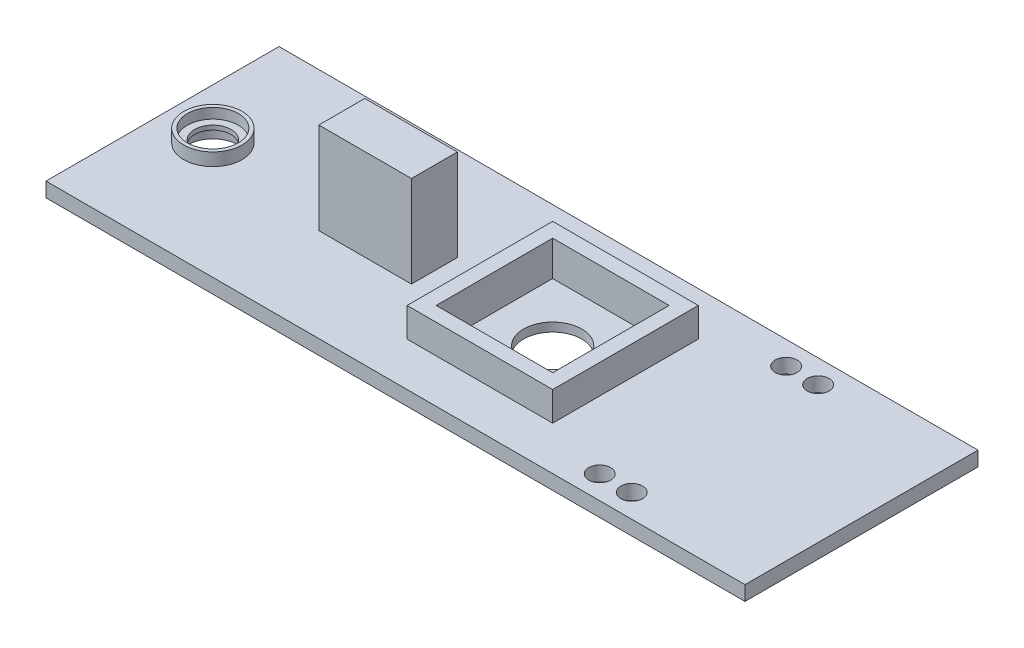
ISO-10303-21;
HEADER;
FILE_DESCRIPTION(('STEP AP214'),'2;1');
FILE_NAME('part.step','',(''),(''),'','','');
FILE_SCHEMA(('AUTOMOTIVE_DESIGN { 1 0 10303 214 1 1 1 1 }'));
ENDSEC;
DATA;
#1=APPLICATION_CONTEXT('core data for automotive mechanical design processes');
#2=APPLICATION_PROTOCOL_DEFINITION('international standard','automotive_design',2000,#1);
#3=PRODUCT_CONTEXT('',#1,'mechanical');
#4=PRODUCT('Part','Part','',(#3));
#5=PRODUCT_RELATED_PRODUCT_CATEGORY('part','',(#4));
#6=PRODUCT_DEFINITION_FORMATION('','',#4);
#7=PRODUCT_DEFINITION_CONTEXT('part definition',#1,'design');
#8=PRODUCT_DEFINITION('design','',#6,#7);
#9=PRODUCT_DEFINITION_SHAPE('','',#8);
#10=(LENGTH_UNIT() NAMED_UNIT(*) SI_UNIT(.MILLI.,.METRE.));
#11=(NAMED_UNIT(*) PLANE_ANGLE_UNIT() SI_UNIT($,.RADIAN.));
#12=(NAMED_UNIT(*) SI_UNIT($,.STERADIAN.) SOLID_ANGLE_UNIT());
#13=UNCERTAINTY_MEASURE_WITH_UNIT(LENGTH_MEASURE(1.E-05),#10,'distance_accuracy_value','');
#14=(GEOMETRIC_REPRESENTATION_CONTEXT(3) GLOBAL_UNCERTAINTY_ASSIGNED_CONTEXT((#13)) GLOBAL_UNIT_ASSIGNED_CONTEXT((#10,
#11,#12)) REPRESENTATION_CONTEXT('',''));
#15=CARTESIAN_POINT('',(0.,0.,0.));
#16=DIRECTION('',(0.,0.,1.));
#17=DIRECTION('',(1.,0.,0.));
#18=AXIS2_PLACEMENT_3D('',#15,#16,#17);
#19=CARTESIAN_POINT('',(-134.66620377136,0.,0.));
#20=DIRECTION('',(0.,1.,0.));
#21=DIRECTION('',(0.,0.,1.));
#22=AXIS2_PLACEMENT_3D('',#19,#20,#21);
#23=CYLINDRICAL_SURFACE('',#22,12.7);
#24=CARTESIAN_POINT('',(-134.66620377136,0.,0.));
#25=DIRECTION('',(0.,1.,0.));
#26=DIRECTION('',(0.,0.,1.));
#27=AXIS2_PLACEMENT_3D('',#24,#25,#26);
#28=CIRCLE('',#27,12.7);
#29=CARTESIAN_POINT('',(-134.66620377136,0.,12.7));
#30=VERTEX_POINT('',#29);
#31=EDGE_CURVE('E260',#30,#30,#28,.T.);
#32=ORIENTED_EDGE('',*,*,#31,.F.);
#33=EDGE_LOOP('',(#32));
#34=FACE_BOUND('',#33,.T.);
#35=CARTESIAN_POINT('',(-134.66620377136,3.81,0.));
#36=DIRECTION('',(0.,1.,0.));
#37=DIRECTION('',(0.,0.,1.));
#38=AXIS2_PLACEMENT_3D('',#35,#36,#37);
#39=CIRCLE('',#38,12.7);
#40=CARTESIAN_POINT('',(-134.66620377136,3.81,12.7));
#41=VERTEX_POINT('',#40);
#42=EDGE_CURVE('E43',#41,#41,#39,.F.);
#43=ORIENTED_EDGE('',*,*,#42,.F.);
#44=EDGE_LOOP('',(#43));
#45=FACE_BOUND('',#44,.T.);
#46=ADVANCED_FACE('F39',(#34,#45),#23,.F.);
#47=CARTESIAN_POINT('',(0.,6.35,0.));
#48=DIRECTION('',(0.,-1.,0.));
#49=DIRECTION('',(0.,0.,-1.));
#50=AXIS2_PLACEMENT_3D('',#47,#48,#49);
#51=PLANE('',#50);
#52=CARTESIAN_POINT('',(-73.5149130477168,6.35,40.64));
#53=DIRECTION('',(0.,1.,0.));
#54=DIRECTION('',(0.,0.,1.));
#55=AXIS2_PLACEMENT_3D('',#52,#53,#54);
#56=CIRCLE('',#55,4.7625);
#57=CARTESIAN_POINT('',(-73.5149130477168,6.35,45.4025));
#58=VERTEX_POINT('',#57);
#59=EDGE_CURVE('E680',#58,#58,#56,.T.);
#60=ORIENTED_EDGE('',*,*,#59,.F.);
#61=EDGE_LOOP('',(#60));
#62=FACE_BOUND('',#61,.T.);
#63=CARTESIAN_POINT('',(-59.5449130477168,6.35,-40.64));
#64=DIRECTION('',(0.,1.,0.));
#65=DIRECTION('',(0.,0.,1.));
#66=AXIS2_PLACEMENT_3D('',#63,#64,#65);
#67=CIRCLE('',#66,4.7625);
#68=CARTESIAN_POINT('',(-59.5449130477168,6.35,-35.8775));
#69=VERTEX_POINT('',#68);
#70=EDGE_CURVE('E685',#69,#69,#67,.T.);
#71=ORIENTED_EDGE('',*,*,#70,.F.);
#72=EDGE_LOOP('',(#71));
#73=FACE_BOUND('',#72,.T.);
#74=CARTESIAN_POINT('',(-73.5149130477168,6.35,-40.64));
#75=DIRECTION('',(0.,1.,0.));
#76=DIRECTION('',(0.,0.,1.));
#77=AXIS2_PLACEMENT_3D('',#74,#75,#76);
#78=CIRCLE('',#77,4.7625);
#79=CARTESIAN_POINT('',(-73.5149130477168,6.35,-35.8775));
#80=VERTEX_POINT('',#79);
#81=EDGE_CURVE('E702',#80,#80,#78,.T.);
#82=ORIENTED_EDGE('',*,*,#81,.F.);
#83=EDGE_LOOP('',(#82));
#84=FACE_BOUND('',#83,.T.);
#85=CARTESIAN_POINT('',(-59.5449130477168,6.35,40.64));
#86=DIRECTION('',(0.,1.,0.));
#87=DIRECTION('',(0.,0.,1.));
#88=AXIS2_PLACEMENT_3D('',#85,#86,#87);
#89=CIRCLE('',#88,4.7625);
#90=CARTESIAN_POINT('',(-59.5449130477168,6.35,45.4025));
#91=VERTEX_POINT('',#90);
#92=EDGE_CURVE('E181',#91,#91,#89,.T.);
#93=ORIENTED_EDGE('',*,*,#92,.F.);
#94=EDGE_LOOP('',(#93));
#95=FACE_BOUND('',#94,.T.);
#96=DIRECTION('',(0.,0.,-1.));
#97=VECTOR('',#96,1.);
#98=CARTESIAN_POINT('',(-226.61201316896,6.35,10.033));
#99=LINE('',#98,#97);
#100=CARTESIAN_POINT('',(-226.61201316896,6.35,10.033));
#101=VERTEX_POINT('',#100);
#102=CARTESIAN_POINT('',(-226.61201316896,6.35,-10.033));
#103=VERTEX_POINT('',#102);
#104=EDGE_CURVE('E56',#101,#103,#99,.T.);
#105=ORIENTED_EDGE('',*,*,#104,.T.);
#106=DIRECTION('',(1.,0.,0.));
#107=VECTOR('',#106,1.);
#108=CARTESIAN_POINT('',(-226.61201316896,6.35,-10.033));
#109=LINE('',#108,#107);
#110=CARTESIAN_POINT('',(-186.22601316896,6.35,-10.033));
#111=VERTEX_POINT('',#110);
#112=EDGE_CURVE('E186',#103,#111,#109,.T.);
#113=ORIENTED_EDGE('',*,*,#112,.T.);
#114=DIRECTION('',(0.,0.,-1.));
#115=VECTOR('',#114,1.);
#116=CARTESIAN_POINT('',(-186.22601316896,6.35,10.033));
#117=LINE('',#116,#115);
#118=CARTESIAN_POINT('',(-186.22601316896,6.35,10.033));
#119=VERTEX_POINT('',#118);
#120=EDGE_CURVE('E170',#119,#111,#117,.T.);
#121=ORIENTED_EDGE('',*,*,#120,.F.);
#122=DIRECTION('',(1.,0.,0.));
#123=VECTOR('',#122,1.);
#124=CARTESIAN_POINT('',(-226.61201316896,6.35,10.033));
#125=LINE('',#124,#123);
#126=EDGE_CURVE('E61',#101,#119,#125,.T.);
#127=ORIENTED_EDGE('',*,*,#126,.F.);
#128=EDGE_LOOP('',(#105,#113,#121,#127));
#129=FACE_BOUND('',#128,.T.);
#130=DIRECTION('',(0.,0.,-1.));
#131=VECTOR('',#130,1.);
#132=CARTESIAN_POINT('',(0.,6.35,50.8));
#133=LINE('',#132,#131);
#134=CARTESIAN_POINT('',(0.,6.35,50.8));
#135=VERTEX_POINT('',#134);
#136=CARTESIAN_POINT('',(0.,6.35,-50.8));
#137=VERTEX_POINT('',#136);
#138=EDGE_CURVE('E283',#135,#137,#133,.T.);
#139=ORIENTED_EDGE('',*,*,#138,.T.);
#140=DIRECTION('',(-1.,0.,0.));
#141=VECTOR('',#140,1.);
#142=CARTESIAN_POINT('',(-304.8,6.35,-50.8));
#143=LINE('',#142,#141);
#144=CARTESIAN_POINT('',(-304.8,6.35,-50.8));
#145=VERTEX_POINT('',#144);
#146=EDGE_CURVE('E286',#137,#145,#143,.T.);
#147=ORIENTED_EDGE('',*,*,#146,.T.);
#148=DIRECTION('',(0.,0.,1.));
#149=VECTOR('',#148,1.);
#150=CARTESIAN_POINT('',(-304.8,6.35,50.8));
#151=LINE('',#150,#149);
#152=CARTESIAN_POINT('',(-304.8,6.35,50.8));
#153=VERTEX_POINT('',#152);
#154=EDGE_CURVE('E289',#145,#153,#151,.T.);
#155=ORIENTED_EDGE('',*,*,#154,.T.);
#156=DIRECTION('',(1.,0.,0.));
#157=VECTOR('',#156,1.);
#158=CARTESIAN_POINT('',(-304.8,6.35,50.8));
#159=LINE('',#158,#157);
#160=EDGE_CURVE('E291',#153,#135,#159,.T.);
#161=ORIENTED_EDGE('',*,*,#160,.T.);
#162=EDGE_LOOP('',(#139,#147,#155,#161));
#163=FACE_BOUND('',#162,.T.);
#164=CARTESIAN_POINT('',(-282.839226834483,6.35,0.));
#165=DIRECTION('',(0.,-1.,0.));
#166=DIRECTION('',(0.,0.,-1.));
#167=AXIS2_PLACEMENT_3D('',#164,#165,#166);
#168=CIRCLE('',#167,12.7);
#169=CARTESIAN_POINT('',(-282.839226834483,6.35,-12.7));
#170=VERTEX_POINT('',#169);
#171=EDGE_CURVE('E11',#170,#170,#168,.F.);
#172=ORIENTED_EDGE('',*,*,#171,.F.);
#173=EDGE_LOOP('',(#172));
#174=FACE_BOUND('',#173,.T.);
#175=DIRECTION('',(0.,0.,1.));
#176=VECTOR('',#175,1.);
#177=CARTESIAN_POINT('',(-166.41620377136,6.35,31.75));
#178=LINE('',#177,#176);
#179=CARTESIAN_POINT('',(-166.41620377136,6.35,-31.75));
#180=VERTEX_POINT('',#179);
#181=CARTESIAN_POINT('',(-166.41620377136,6.35,31.75));
#182=VERTEX_POINT('',#181);
#183=EDGE_CURVE('E238',#180,#182,#178,.T.);
#184=ORIENTED_EDGE('',*,*,#183,.F.);
#185=DIRECTION('',(-1.,0.,0.));
#186=VECTOR('',#185,1.);
#187=CARTESIAN_POINT('',(-102.91620377136,6.35,-31.75));
#188=LINE('',#187,#186);
#189=CARTESIAN_POINT('',(-102.91620377136,6.35,-31.75));
#190=VERTEX_POINT('',#189);
#191=EDGE_CURVE('E231',#190,#180,#188,.T.);
#192=ORIENTED_EDGE('',*,*,#191,.F.);
#193=DIRECTION('',(0.,0.,-1.));
#194=VECTOR('',#193,1.);
#195=CARTESIAN_POINT('',(-102.91620377136,6.35,31.75));
#196=LINE('',#195,#194);
#197=CARTESIAN_POINT('',(-102.91620377136,6.35,31.75));
#198=VERTEX_POINT('',#197);
#199=EDGE_CURVE('E244',#198,#190,#196,.T.);
#200=ORIENTED_EDGE('',*,*,#199,.F.);
#201=DIRECTION('',(1.,0.,0.));
#202=VECTOR('',#201,1.);
#203=CARTESIAN_POINT('',(-102.91620377136,6.35,31.75));
#204=LINE('',#203,#202);
#205=EDGE_CURVE('E241',#182,#198,#204,.T.);
#206=ORIENTED_EDGE('',*,*,#205,.F.);
#207=EDGE_LOOP('',(#184,#192,#200,#206));
#208=FACE_BOUND('',#207,.T.);
#209=ADVANCED_FACE('F353',(#62,#73,#84,#95,#129,#163,#174,#208),#51,.F.);
#210=CARTESIAN_POINT('',(0.,6.35,50.8));
#211=DIRECTION('',(-1.,0.,0.));
#212=DIRECTION('',(0.,0.,1.));
#213=AXIS2_PLACEMENT_3D('',#210,#211,#212);
#214=PLANE('',#213);
#215=DIRECTION('',(0.,0.,-1.));
#216=VECTOR('',#215,1.);
#217=CARTESIAN_POINT('',(0.,0.,50.8));
#218=LINE('',#217,#216);
#219=CARTESIAN_POINT('',(0.,0.,50.8));
#220=VERTEX_POINT('',#219);
#221=CARTESIAN_POINT('',(0.,0.,-50.8));
#222=VERTEX_POINT('',#221);
#223=EDGE_CURVE('E282',#220,#222,#218,.T.);
#224=ORIENTED_EDGE('',*,*,#223,.T.);
#225=DIRECTION('',(0.,-1.,0.));
#226=VECTOR('',#225,1.);
#227=CARTESIAN_POINT('',(0.,6.35,-50.8));
#228=LINE('',#227,#226);
#229=EDGE_CURVE('E48',#137,#222,#228,.T.);
#230=ORIENTED_EDGE('',*,*,#229,.F.);
#231=ORIENTED_EDGE('',*,*,#138,.F.);
#232=DIRECTION('',(0.,-1.,0.));
#233=VECTOR('',#232,1.);
#234=CARTESIAN_POINT('',(0.,6.35,50.8));
#235=LINE('',#234,#233);
#236=EDGE_CURVE('E293',#135,#220,#235,.T.);
#237=ORIENTED_EDGE('',*,*,#236,.T.);
#238=EDGE_LOOP('',(#224,#230,#231,#237));
#239=FACE_BOUND('',#238,.T.);
#240=ADVANCED_FACE('F41',(#239),#214,.F.);
#241=CARTESIAN_POINT('',(-304.8,6.35,-50.8));
#242=DIRECTION('',(0.,0.,1.));
#243=DIRECTION('',(1.,0.,0.));
#244=AXIS2_PLACEMENT_3D('',#241,#242,#243);
#245=PLANE('',#244);
#246=DIRECTION('',(-1.,0.,0.));
#247=VECTOR('',#246,1.);
#248=CARTESIAN_POINT('',(-304.8,0.,-50.8));
#249=LINE('',#248,#247);
#250=CARTESIAN_POINT('',(-304.8,0.,-50.8));
#251=VERTEX_POINT('',#250);
#252=EDGE_CURVE('E296',#222,#251,#249,.T.);
#253=ORIENTED_EDGE('',*,*,#252,.T.);
#254=DIRECTION('',(0.,-1.,0.));
#255=VECTOR('',#254,1.);
#256=CARTESIAN_POINT('',(-304.8,6.35,-50.8));
#257=LINE('',#256,#255);
#258=EDGE_CURVE('E306',#145,#251,#257,.T.);
#259=ORIENTED_EDGE('',*,*,#258,.F.);
#260=ORIENTED_EDGE('',*,*,#146,.F.);
#261=ORIENTED_EDGE('',*,*,#229,.T.);
#262=EDGE_LOOP('',(#253,#259,#260,#261));
#263=FACE_BOUND('',#262,.T.);
#264=ADVANCED_FACE('F351',(#263),#245,.F.);
#265=CARTESIAN_POINT('',(-304.8,6.35,50.8));
#266=DIRECTION('',(1.,0.,0.));
#267=DIRECTION('',(0.,0.,-1.));
#268=AXIS2_PLACEMENT_3D('',#265,#266,#267);
#269=PLANE('',#268);
#270=DIRECTION('',(0.,0.,1.));
#271=VECTOR('',#270,1.);
#272=CARTESIAN_POINT('',(-304.8,0.,50.8));
#273=LINE('',#272,#271);
#274=CARTESIAN_POINT('',(-304.8,0.,50.8));
#275=VERTEX_POINT('',#274);
#276=EDGE_CURVE('E298',#251,#275,#273,.T.);
#277=ORIENTED_EDGE('',*,*,#276,.T.);
#278=DIRECTION('',(0.,-1.,0.));
#279=VECTOR('',#278,1.);
#280=CARTESIAN_POINT('',(-304.8,6.35,50.8));
#281=LINE('',#280,#279);
#282=EDGE_CURVE('E303',#153,#275,#281,.T.);
#283=ORIENTED_EDGE('',*,*,#282,.F.);
#284=ORIENTED_EDGE('',*,*,#154,.F.);
#285=ORIENTED_EDGE('',*,*,#258,.T.);
#286=EDGE_LOOP('',(#277,#283,#284,#285));
#287=FACE_BOUND('',#286,.T.);
#288=ADVANCED_FACE('F348',(#287),#269,.F.);
#289=CARTESIAN_POINT('',(-304.8,6.35,50.8));
#290=DIRECTION('',(0.,0.,-1.));
#291=DIRECTION('',(-1.,0.,0.));
#292=AXIS2_PLACEMENT_3D('',#289,#290,#291);
#293=PLANE('',#292);
#294=DIRECTION('',(1.,0.,0.));
#295=VECTOR('',#294,1.);
#296=CARTESIAN_POINT('',(-304.8,0.,50.8));
#297=LINE('',#296,#295);
#298=EDGE_CURVE('E287',#275,#220,#297,.T.);
#299=ORIENTED_EDGE('',*,*,#298,.T.);
#300=ORIENTED_EDGE('',*,*,#236,.F.);
#301=ORIENTED_EDGE('',*,*,#160,.F.);
#302=ORIENTED_EDGE('',*,*,#282,.T.);
#303=EDGE_LOOP('',(#299,#300,#301,#302));
#304=FACE_BOUND('',#303,.T.);
#305=ADVANCED_FACE('F333',(#304),#293,.F.);
#306=CARTESIAN_POINT('',(0.,0.,0.));
#307=DIRECTION('',(0.,-1.,0.));
#308=DIRECTION('',(0.,0.,-1.));
#309=AXIS2_PLACEMENT_3D('',#306,#307,#308);
#310=PLANE('',#309);
#311=CARTESIAN_POINT('',(-73.5149130477168,0.,40.64));
#312=DIRECTION('',(0.,1.,0.));
#313=DIRECTION('',(0.,0.,1.));
#314=AXIS2_PLACEMENT_3D('',#311,#312,#313);
#315=CIRCLE('',#314,4.7625);
#316=CARTESIAN_POINT('',(-73.5149130477168,0.,45.4025));
#317=VERTEX_POINT('',#316);
#318=EDGE_CURVE('E677',#317,#317,#315,.T.);
#319=ORIENTED_EDGE('',*,*,#318,.T.);
#320=EDGE_LOOP('',(#319));
#321=FACE_BOUND('',#320,.T.);
#322=CARTESIAN_POINT('',(-59.5449130477168,0.,-40.64));
#323=DIRECTION('',(0.,1.,0.));
#324=DIRECTION('',(0.,0.,1.));
#325=AXIS2_PLACEMENT_3D('',#322,#323,#324);
#326=CIRCLE('',#325,4.7625);
#327=CARTESIAN_POINT('',(-59.5449130477168,0.,-35.8775));
#328=VERTEX_POINT('',#327);
#329=EDGE_CURVE('E681',#328,#328,#326,.T.);
#330=ORIENTED_EDGE('',*,*,#329,.T.);
#331=EDGE_LOOP('',(#330));
#332=FACE_BOUND('',#331,.T.);
#333=CARTESIAN_POINT('',(-73.5149130477168,0.,-40.64));
#334=DIRECTION('',(0.,1.,0.));
#335=DIRECTION('',(0.,0.,1.));
#336=AXIS2_PLACEMENT_3D('',#333,#334,#335);
#337=CIRCLE('',#336,4.7625);
#338=CARTESIAN_POINT('',(-73.5149130477168,0.,-35.8775));
#339=VERTEX_POINT('',#338);
#340=EDGE_CURVE('E690',#339,#339,#337,.T.);
#341=ORIENTED_EDGE('',*,*,#340,.T.);
#342=EDGE_LOOP('',(#341));
#343=FACE_BOUND('',#342,.T.);
#344=CARTESIAN_POINT('',(-59.5449130477168,0.,40.64));
#345=DIRECTION('',(0.,1.,0.));
#346=DIRECTION('',(0.,0.,1.));
#347=AXIS2_PLACEMENT_3D('',#344,#345,#346);
#348=CIRCLE('',#347,4.7625);
#349=CARTESIAN_POINT('',(-59.5449130477168,0.,45.4025));
#350=VERTEX_POINT('',#349);
#351=EDGE_CURVE('E188',#350,#350,#348,.T.);
#352=ORIENTED_EDGE('',*,*,#351,.T.);
#353=EDGE_LOOP('',(#352));
#354=FACE_BOUND('',#353,.T.);
#355=ORIENTED_EDGE('',*,*,#31,.T.);
#356=EDGE_LOOP('',(#355));
#357=FACE_BOUND('',#356,.T.);
#358=CARTESIAN_POINT('',(-282.839226834483,0.,0.));
#359=DIRECTION('',(0.,-1.,0.));
#360=DIRECTION('',(0.,0.,-1.));
#361=AXIS2_PLACEMENT_3D('',#358,#359,#360);
#362=CIRCLE('',#361,11.1125);
#363=CARTESIAN_POINT('',(-282.839226834483,0.,-11.1125));
#364=VERTEX_POINT('',#363);
#365=EDGE_CURVE('E271',#364,#364,#362,.T.);
#366=ORIENTED_EDGE('',*,*,#365,.F.);
#367=EDGE_LOOP('',(#366));
#368=FACE_BOUND('',#367,.T.);
#369=ORIENTED_EDGE('',*,*,#223,.F.);
#370=ORIENTED_EDGE('',*,*,#298,.F.);
#371=ORIENTED_EDGE('',*,*,#276,.F.);
#372=ORIENTED_EDGE('',*,*,#252,.F.);
#373=EDGE_LOOP('',(#369,#370,#371,#372));
#374=FACE_BOUND('',#373,.T.);
#375=ADVANCED_FACE('F329',(#321,#332,#343,#354,#357,#368,#374),#310,.T.);
#376=CARTESIAN_POINT('',(-282.839226834483,11.90625,0.));
#377=DIRECTION('',(0.,-1.,0.));
#378=DIRECTION('',(0.,0.,-1.));
#379=AXIS2_PLACEMENT_3D('',#376,#377,#378);
#380=CYLINDRICAL_SURFACE('',#379,12.7);
#381=CARTESIAN_POINT('',(-282.839226834483,11.90625,0.));
#382=DIRECTION('',(0.,1.,0.));
#383=DIRECTION('',(0.,0.,1.));
#384=AXIS2_PLACEMENT_3D('',#381,#382,#383);
#385=CIRCLE('',#384,12.7);
#386=CARTESIAN_POINT('',(-282.839226834483,11.90625,12.7));
#387=VERTEX_POINT('',#386);
#388=EDGE_CURVE('E277',#387,#387,#385,.T.);
#389=ORIENTED_EDGE('',*,*,#388,.F.);
#390=EDGE_LOOP('',(#389));
#391=FACE_BOUND('',#390,.T.);
#392=ORIENTED_EDGE('',*,*,#171,.T.);
#393=EDGE_LOOP('',(#392));
#394=FACE_BOUND('',#393,.T.);
#395=ADVANCED_FACE('F332',(#391,#394),#380,.T.);
#396=CARTESIAN_POINT('',(-282.839226834483,11.90625,0.));
#397=DIRECTION('',(0.,1.,0.));
#398=DIRECTION('',(0.,0.,1.));
#399=AXIS2_PLACEMENT_3D('',#396,#397,#398);
#400=PLANE('',#399);
#401=CARTESIAN_POINT('',(-282.839226834483,11.90625,0.));
#402=DIRECTION('',(0.,1.,0.));
#403=DIRECTION('',(0.,0.,1.));
#404=AXIS2_PLACEMENT_3D('',#401,#402,#403);
#405=CIRCLE('',#404,11.1125);
#406=CARTESIAN_POINT('',(-282.839226834483,11.90625,11.1125));
#407=VERTEX_POINT('',#406);
#408=EDGE_CURVE('E270',#407,#407,#405,.T.);
#409=ORIENTED_EDGE('',*,*,#408,.F.);
#410=EDGE_LOOP('',(#409));
#411=FACE_BOUND('',#410,.T.);
#412=ORIENTED_EDGE('',*,*,#388,.T.);
#413=EDGE_LOOP('',(#412));
#414=FACE_BOUND('',#413,.T.);
#415=ADVANCED_FACE('F401',(#411,#414),#400,.T.);
#416=CARTESIAN_POINT('',(-282.839226834483,7.46125,0.));
#417=DIRECTION('',(0.,1.,0.));
#418=DIRECTION('',(0.,0.,1.));
#419=AXIS2_PLACEMENT_3D('',#416,#417,#418);
#420=CYLINDRICAL_SURFACE('',#419,11.1125);
#421=CARTESIAN_POINT('',(-282.839226834483,7.46125,0.));
#422=DIRECTION('',(0.,1.,0.));
#423=DIRECTION('',(0.,0.,1.));
#424=AXIS2_PLACEMENT_3D('',#421,#422,#423);
#425=CIRCLE('',#424,11.1125);
#426=CARTESIAN_POINT('',(-282.839226834483,7.46125,11.1125));
#427=VERTEX_POINT('',#426);
#428=EDGE_CURVE('E274',#427,#427,#425,.T.);
#429=ORIENTED_EDGE('',*,*,#428,.F.);
#430=EDGE_LOOP('',(#429));
#431=FACE_BOUND('',#430,.T.);
#432=ORIENTED_EDGE('',*,*,#408,.T.);
#433=EDGE_LOOP('',(#432));
#434=FACE_BOUND('',#433,.T.);
#435=ADVANCED_FACE('F397',(#431,#434),#420,.F.);
#436=CARTESIAN_POINT('',(-282.839226834483,7.46125,0.));
#437=DIRECTION('',(0.,1.,0.));
#438=DIRECTION('',(0.,0.,1.));
#439=AXIS2_PLACEMENT_3D('',#436,#437,#438);
#440=PLANE('',#439);
#441=CARTESIAN_POINT('',(-282.839226834483,7.46125,0.));
#442=DIRECTION('',(0.,1.,0.));
#443=DIRECTION('',(0.,0.,1.));
#444=AXIS2_PLACEMENT_3D('',#441,#442,#443);
#445=CIRCLE('',#444,7.93749999999998);
#446=CARTESIAN_POINT('',(-282.839226834483,7.46125,7.93749999999998));
#447=VERTEX_POINT('',#446);
#448=EDGE_CURVE('E263',#447,#447,#445,.T.);
#449=ORIENTED_EDGE('',*,*,#448,.F.);
#450=EDGE_LOOP('',(#449));
#451=FACE_BOUND('',#450,.T.);
#452=ORIENTED_EDGE('',*,*,#428,.T.);
#453=EDGE_LOOP('',(#452));
#454=FACE_BOUND('',#453,.T.);
#455=ADVANCED_FACE('F325',(#451,#454),#440,.T.);
#456=CARTESIAN_POINT('',(-282.839226834483,5.55625,0.));
#457=DIRECTION('',(0.,-1.,0.));
#458=DIRECTION('',(0.,0.,-1.));
#459=AXIS2_PLACEMENT_3D('',#456,#457,#458);
#460=CYLINDRICAL_SURFACE('',#459,11.1125);
#461=CARTESIAN_POINT('',(-282.839226834483,5.55625,0.));
#462=DIRECTION('',(0.,-1.,0.));
#463=DIRECTION('',(0.,0.,-1.));
#464=AXIS2_PLACEMENT_3D('',#461,#462,#463);
#465=CIRCLE('',#464,11.1125);
#466=CARTESIAN_POINT('',(-282.839226834483,5.55625,-11.1125));
#467=VERTEX_POINT('',#466);
#468=EDGE_CURVE('E267',#467,#467,#465,.T.);
#469=ORIENTED_EDGE('',*,*,#468,.F.);
#470=EDGE_LOOP('',(#469));
#471=FACE_BOUND('',#470,.T.);
#472=ORIENTED_EDGE('',*,*,#365,.T.);
#473=EDGE_LOOP('',(#472));
#474=FACE_BOUND('',#473,.T.);
#475=ADVANCED_FACE('F319',(#471,#474),#460,.F.);
#476=CARTESIAN_POINT('',(-282.839226834483,5.55625,0.));
#477=DIRECTION('',(0.,-1.,0.));
#478=DIRECTION('',(0.,0.,-1.));
#479=AXIS2_PLACEMENT_3D('',#476,#477,#478);
#480=PLANE('',#479);
#481=CARTESIAN_POINT('',(-282.839226834483,5.55625,0.));
#482=DIRECTION('',(0.,-1.,0.));
#483=DIRECTION('',(0.,0.,-1.));
#484=AXIS2_PLACEMENT_3D('',#481,#482,#483);
#485=CIRCLE('',#484,7.93749999999998);
#486=CARTESIAN_POINT('',(-282.839226834483,5.55625,-7.93749999999998));
#487=VERTEX_POINT('',#486);
#488=EDGE_CURVE('E266',#487,#487,#485,.T.);
#489=ORIENTED_EDGE('',*,*,#488,.F.);
#490=EDGE_LOOP('',(#489));
#491=FACE_BOUND('',#490,.T.);
#492=ORIENTED_EDGE('',*,*,#468,.T.);
#493=EDGE_LOOP('',(#492));
#494=FACE_BOUND('',#493,.T.);
#495=ADVANCED_FACE('F316',(#491,#494),#480,.T.);
#496=CARTESIAN_POINT('',(-282.839226834483,0.,0.));
#497=DIRECTION('',(0.,1.,0.));
#498=DIRECTION('',(0.,0.,1.));
#499=AXIS2_PLACEMENT_3D('',#496,#497,#498);
#500=CYLINDRICAL_SURFACE('',#499,7.93749999999998);
#501=ORIENTED_EDGE('',*,*,#488,.T.);
#502=EDGE_LOOP('',(#501));
#503=FACE_BOUND('',#502,.T.);
#504=ORIENTED_EDGE('',*,*,#448,.T.);
#505=EDGE_LOOP('',(#504));
#506=FACE_BOUND('',#505,.T.);
#507=ADVANCED_FACE('F313',(#503,#506),#500,.F.);
#508=CARTESIAN_POINT('',(-166.41620377136,19.05,31.75));
#509=DIRECTION('',(1.,0.,0.));
#510=DIRECTION('',(0.,0.,-1.));
#511=AXIS2_PLACEMENT_3D('',#508,#509,#510);
#512=PLANE('',#511);
#513=ORIENTED_EDGE('',*,*,#183,.T.);
#514=DIRECTION('',(0.,-1.,0.));
#515=VECTOR('',#514,1.);
#516=CARTESIAN_POINT('',(-166.41620377136,19.05,31.75));
#517=LINE('',#516,#515);
#518=CARTESIAN_POINT('',(-166.41620377136,19.05,31.75));
#519=VERTEX_POINT('',#518);
#520=EDGE_CURVE('E257',#519,#182,#517,.T.);
#521=ORIENTED_EDGE('',*,*,#520,.F.);
#522=DIRECTION('',(0.,0.,1.));
#523=VECTOR('',#522,1.);
#524=CARTESIAN_POINT('',(-166.41620377136,19.05,31.75));
#525=LINE('',#524,#523);
#526=CARTESIAN_POINT('',(-166.41620377136,19.05,-31.75));
#527=VERTEX_POINT('',#526);
#528=EDGE_CURVE('E227',#527,#519,#525,.T.);
#529=ORIENTED_EDGE('',*,*,#528,.F.);
#530=DIRECTION('',(0.,-1.,0.));
#531=VECTOR('',#530,1.);
#532=CARTESIAN_POINT('',(-166.41620377136,19.05,-31.75));
#533=LINE('',#532,#531);
#534=EDGE_CURVE('E237',#527,#180,#533,.T.);
#535=ORIENTED_EDGE('',*,*,#534,.T.);
#536=EDGE_LOOP('',(#513,#521,#529,#535));
#537=FACE_BOUND('',#536,.T.);
#538=ADVANCED_FACE('F368',(#537),#512,.F.);
#539=CARTESIAN_POINT('',(-102.91620377136,19.05,31.75));
#540=DIRECTION('',(0.,0.,-1.));
#541=DIRECTION('',(-1.,0.,0.));
#542=AXIS2_PLACEMENT_3D('',#539,#540,#541);
#543=PLANE('',#542);
#544=ORIENTED_EDGE('',*,*,#205,.T.);
#545=DIRECTION('',(0.,-1.,0.));
#546=VECTOR('',#545,1.);
#547=CARTESIAN_POINT('',(-102.91620377136,19.05,31.75));
#548=LINE('',#547,#546);
#549=CARTESIAN_POINT('',(-102.91620377136,19.05,31.75));
#550=VERTEX_POINT('',#549);
#551=EDGE_CURVE('E254',#550,#198,#548,.T.);
#552=ORIENTED_EDGE('',*,*,#551,.F.);
#553=DIRECTION('',(1.,0.,0.));
#554=VECTOR('',#553,1.);
#555=CARTESIAN_POINT('',(-102.91620377136,19.05,31.75));
#556=LINE('',#555,#554);
#557=EDGE_CURVE('E230',#519,#550,#556,.T.);
#558=ORIENTED_EDGE('',*,*,#557,.F.);
#559=ORIENTED_EDGE('',*,*,#520,.T.);
#560=EDGE_LOOP('',(#544,#552,#558,#559));
#561=FACE_BOUND('',#560,.T.);
#562=ADVANCED_FACE('F376',(#561),#543,.F.);
#563=CARTESIAN_POINT('',(-102.91620377136,19.05,31.75));
#564=DIRECTION('',(-1.,0.,0.));
#565=DIRECTION('',(0.,0.,1.));
#566=AXIS2_PLACEMENT_3D('',#563,#564,#565);
#567=PLANE('',#566);
#568=ORIENTED_EDGE('',*,*,#199,.T.);
#569=DIRECTION('',(0.,-1.,0.));
#570=VECTOR('',#569,1.);
#571=CARTESIAN_POINT('',(-102.91620377136,19.05,-31.75));
#572=LINE('',#571,#570);
#573=CARTESIAN_POINT('',(-102.91620377136,19.05,-31.75));
#574=VERTEX_POINT('',#573);
#575=EDGE_CURVE('E251',#574,#190,#572,.T.);
#576=ORIENTED_EDGE('',*,*,#575,.F.);
#577=DIRECTION('',(0.,0.,-1.));
#578=VECTOR('',#577,1.);
#579=CARTESIAN_POINT('',(-102.91620377136,19.05,31.75));
#580=LINE('',#579,#578);
#581=EDGE_CURVE('E233',#550,#574,#580,.T.);
#582=ORIENTED_EDGE('',*,*,#581,.F.);
#583=ORIENTED_EDGE('',*,*,#551,.T.);
#584=EDGE_LOOP('',(#568,#576,#582,#583));
#585=FACE_BOUND('',#584,.T.);
#586=ADVANCED_FACE('F374',(#585),#567,.F.);
#587=CARTESIAN_POINT('',(-102.91620377136,19.05,-31.75));
#588=DIRECTION('',(0.,0.,1.));
#589=DIRECTION('',(1.,0.,0.));
#590=AXIS2_PLACEMENT_3D('',#587,#588,#589);
#591=PLANE('',#590);
#592=ORIENTED_EDGE('',*,*,#191,.T.);
#593=ORIENTED_EDGE('',*,*,#534,.F.);
#594=DIRECTION('',(-1.,0.,0.));
#595=VECTOR('',#594,1.);
#596=CARTESIAN_POINT('',(-102.91620377136,19.05,-31.75));
#597=LINE('',#596,#595);
#598=EDGE_CURVE('E235',#574,#527,#597,.T.);
#599=ORIENTED_EDGE('',*,*,#598,.F.);
#600=ORIENTED_EDGE('',*,*,#575,.T.);
#601=EDGE_LOOP('',(#592,#593,#599,#600));
#602=FACE_BOUND('',#601,.T.);
#603=ADVANCED_FACE('F364',(#602),#591,.F.);
#604=CARTESIAN_POINT('',(0.,19.05,0.));
#605=DIRECTION('',(0.,1.,0.));
#606=DIRECTION('',(0.,0.,1.));
#607=AXIS2_PLACEMENT_3D('',#604,#605,#606);
#608=PLANE('',#607);
#609=DIRECTION('',(0.,0.,1.));
#610=VECTOR('',#609,1.);
#611=CARTESIAN_POINT('',(-160.06620377136,19.05,25.4));
#612=LINE('',#611,#610);
#613=CARTESIAN_POINT('',(-160.06620377136,19.05,-25.4));
#614=VERTEX_POINT('',#613);
#615=CARTESIAN_POINT('',(-160.06620377136,19.05,25.4));
#616=VERTEX_POINT('',#615);
#617=EDGE_CURVE('E192',#614,#616,#612,.T.);
#618=ORIENTED_EDGE('',*,*,#617,.F.);
#619=DIRECTION('',(-1.,0.,0.));
#620=VECTOR('',#619,1.);
#621=CARTESIAN_POINT('',(-109.26620377136,19.05,-25.4));
#622=LINE('',#621,#620);
#623=CARTESIAN_POINT('',(-109.26620377136,19.05,-25.4));
#624=VERTEX_POINT('',#623);
#625=EDGE_CURVE('E200',#624,#614,#622,.T.);
#626=ORIENTED_EDGE('',*,*,#625,.F.);
#627=DIRECTION('',(0.,0.,-1.));
#628=VECTOR('',#627,1.);
#629=CARTESIAN_POINT('',(-109.26620377136,19.05,25.4));
#630=LINE('',#629,#628);
#631=CARTESIAN_POINT('',(-109.26620377136,19.05,25.4));
#632=VERTEX_POINT('',#631);
#633=EDGE_CURVE('E214',#632,#624,#630,.T.);
#634=ORIENTED_EDGE('',*,*,#633,.F.);
#635=DIRECTION('',(1.,0.,0.));
#636=VECTOR('',#635,1.);
#637=CARTESIAN_POINT('',(-109.26620377136,19.05,25.4));
#638=LINE('',#637,#636);
#639=EDGE_CURVE('E211',#616,#632,#638,.T.);
#640=ORIENTED_EDGE('',*,*,#639,.F.);
#641=EDGE_LOOP('',(#618,#626,#634,#640));
#642=FACE_BOUND('',#641,.T.);
#643=ORIENTED_EDGE('',*,*,#528,.T.);
#644=ORIENTED_EDGE('',*,*,#557,.T.);
#645=ORIENTED_EDGE('',*,*,#581,.T.);
#646=ORIENTED_EDGE('',*,*,#598,.T.);
#647=EDGE_LOOP('',(#643,#644,#645,#646));
#648=FACE_BOUND('',#647,.T.);
#649=ADVANCED_FACE('F370',(#642,#648),#608,.T.);
#650=CARTESIAN_POINT('',(0.,3.81,0.));
#651=DIRECTION('',(0.,1.,0.));
#652=DIRECTION('',(0.,0.,1.));
#653=AXIS2_PLACEMENT_3D('',#650,#651,#652);
#654=PLANE('',#653);
#655=DIRECTION('',(0.,0.,1.));
#656=VECTOR('',#655,1.);
#657=CARTESIAN_POINT('',(-160.06620377136,3.81,25.4));
#658=LINE('',#657,#656);
#659=CARTESIAN_POINT('',(-160.06620377136,3.81,-25.4));
#660=VERTEX_POINT('',#659);
#661=CARTESIAN_POINT('',(-160.06620377136,3.81,25.4));
#662=VERTEX_POINT('',#661);
#663=EDGE_CURVE('E196',#660,#662,#658,.T.);
#664=ORIENTED_EDGE('',*,*,#663,.T.);
#665=DIRECTION('',(1.,0.,0.));
#666=VECTOR('',#665,1.);
#667=CARTESIAN_POINT('',(-109.26620377136,3.81,25.4));
#668=LINE('',#667,#666);
#669=CARTESIAN_POINT('',(-109.26620377136,3.81,25.4));
#670=VERTEX_POINT('',#669);
#671=EDGE_CURVE('E199',#662,#670,#668,.T.);
#672=ORIENTED_EDGE('',*,*,#671,.T.);
#673=DIRECTION('',(0.,0.,-1.));
#674=VECTOR('',#673,1.);
#675=CARTESIAN_POINT('',(-109.26620377136,3.81,25.4));
#676=LINE('',#675,#674);
#677=CARTESIAN_POINT('',(-109.26620377136,3.81,-25.4));
#678=VERTEX_POINT('',#677);
#679=EDGE_CURVE('E203',#670,#678,#676,.T.);
#680=ORIENTED_EDGE('',*,*,#679,.T.);
#681=DIRECTION('',(-1.,0.,0.));
#682=VECTOR('',#681,1.);
#683=CARTESIAN_POINT('',(-109.26620377136,3.81,-25.4));
#684=LINE('',#683,#682);
#685=EDGE_CURVE('E206',#678,#660,#684,.T.);
#686=ORIENTED_EDGE('',*,*,#685,.T.);
#687=EDGE_LOOP('',(#664,#672,#680,#686));
#688=FACE_BOUND('',#687,.T.);
#689=ORIENTED_EDGE('',*,*,#42,.T.);
#690=EDGE_LOOP('',(#689));
#691=FACE_BOUND('',#690,.T.);
#692=ADVANCED_FACE('F498',(#688,#691),#654,.T.);
#693=CARTESIAN_POINT('',(-160.06620377136,3.81,25.4));
#694=DIRECTION('',(-1.,0.,0.));
#695=DIRECTION('',(0.,0.,1.));
#696=AXIS2_PLACEMENT_3D('',#693,#694,#695);
#697=PLANE('',#696);
#698=ORIENTED_EDGE('',*,*,#617,.T.);
#699=DIRECTION('',(0.,1.,0.));
#700=VECTOR('',#699,1.);
#701=CARTESIAN_POINT('',(-160.06620377136,3.81,25.4));
#702=LINE('',#701,#700);
#703=EDGE_CURVE('E209',#662,#616,#702,.T.);
#704=ORIENTED_EDGE('',*,*,#703,.F.);
#705=ORIENTED_EDGE('',*,*,#663,.F.);
#706=DIRECTION('',(0.,1.,0.));
#707=VECTOR('',#706,1.);
#708=CARTESIAN_POINT('',(-160.06620377136,3.81,-25.4));
#709=LINE('',#708,#707);
#710=EDGE_CURVE('E219',#660,#614,#709,.T.);
#711=ORIENTED_EDGE('',*,*,#710,.T.);
#712=EDGE_LOOP('',(#698,#704,#705,#711));
#713=FACE_BOUND('',#712,.T.);
#714=ADVANCED_FACE('F501',(#713),#697,.F.);
#715=CARTESIAN_POINT('',(-109.26620377136,3.81,-25.4));
#716=DIRECTION('',(0.,0.,-1.));
#717=DIRECTION('',(-1.,0.,0.));
#718=AXIS2_PLACEMENT_3D('',#715,#716,#717);
#719=PLANE('',#718);
#720=ORIENTED_EDGE('',*,*,#625,.T.);
#721=ORIENTED_EDGE('',*,*,#710,.F.);
#722=ORIENTED_EDGE('',*,*,#685,.F.);
#723=DIRECTION('',(0.,1.,0.));
#724=VECTOR('',#723,1.);
#725=CARTESIAN_POINT('',(-109.26620377136,3.81,-25.4));
#726=LINE('',#725,#724);
#727=EDGE_CURVE('E221',#678,#624,#726,.T.);
#728=ORIENTED_EDGE('',*,*,#727,.T.);
#729=EDGE_LOOP('',(#720,#721,#722,#728));
#730=FACE_BOUND('',#729,.T.);
#731=ADVANCED_FACE('F503',(#730),#719,.F.);
#732=CARTESIAN_POINT('',(-109.26620377136,3.81,25.4));
#733=DIRECTION('',(1.,0.,0.));
#734=DIRECTION('',(0.,0.,-1.));
#735=AXIS2_PLACEMENT_3D('',#732,#733,#734);
#736=PLANE('',#735);
#737=ORIENTED_EDGE('',*,*,#633,.T.);
#738=ORIENTED_EDGE('',*,*,#727,.F.);
#739=ORIENTED_EDGE('',*,*,#679,.F.);
#740=DIRECTION('',(0.,1.,0.));
#741=VECTOR('',#740,1.);
#742=CARTESIAN_POINT('',(-109.26620377136,3.81,25.4));
#743=LINE('',#742,#741);
#744=EDGE_CURVE('E223',#670,#632,#743,.T.);
#745=ORIENTED_EDGE('',*,*,#744,.T.);
#746=EDGE_LOOP('',(#737,#738,#739,#745));
#747=FACE_BOUND('',#746,.T.);
#748=ADVANCED_FACE('F506',(#747),#736,.F.);
#749=CARTESIAN_POINT('',(-109.26620377136,3.81,25.4));
#750=DIRECTION('',(0.,0.,1.));
#751=DIRECTION('',(1.,0.,0.));
#752=AXIS2_PLACEMENT_3D('',#749,#750,#751);
#753=PLANE('',#752);
#754=ORIENTED_EDGE('',*,*,#639,.T.);
#755=ORIENTED_EDGE('',*,*,#744,.F.);
#756=ORIENTED_EDGE('',*,*,#671,.F.);
#757=ORIENTED_EDGE('',*,*,#703,.T.);
#758=EDGE_LOOP('',(#754,#755,#756,#757));
#759=FACE_BOUND('',#758,.T.);
#760=ADVANCED_FACE('F497',(#759),#753,.F.);
#761=CARTESIAN_POINT('',(-226.61201316896,46.228,-10.033));
#762=DIRECTION('',(0.,0.,-1.));
#763=DIRECTION('',(-1.,0.,0.));
#764=AXIS2_PLACEMENT_3D('',#761,#762,#763);
#765=PLANE('',#764);
#766=ORIENTED_EDGE('',*,*,#112,.F.);
#767=DIRECTION('',(0.,-1.,0.));
#768=VECTOR('',#767,1.);
#769=CARTESIAN_POINT('',(-226.61201316896,46.228,-10.033));
#770=LINE('',#769,#768);
#771=CARTESIAN_POINT('',(-226.61201316896,46.228,-10.033));
#772=VERTEX_POINT('',#771);
#773=EDGE_CURVE('E177',#772,#103,#770,.T.);
#774=ORIENTED_EDGE('',*,*,#773,.F.);
#775=DIRECTION('',(1.,0.,0.));
#776=VECTOR('',#775,1.);
#777=CARTESIAN_POINT('',(-226.61201316896,46.228,-10.033));
#778=LINE('',#777,#776);
#779=CARTESIAN_POINT('',(-186.22601316896,46.228,-10.033));
#780=VERTEX_POINT('',#779);
#781=EDGE_CURVE('E158',#772,#780,#778,.T.);
#782=ORIENTED_EDGE('',*,*,#781,.T.);
#783=DIRECTION('',(0.,-1.,0.));
#784=VECTOR('',#783,1.);
#785=CARTESIAN_POINT('',(-186.22601316896,46.228,-10.033));
#786=LINE('',#785,#784);
#787=EDGE_CURVE('E168',#780,#111,#786,.T.);
#788=ORIENTED_EDGE('',*,*,#787,.T.);
#789=EDGE_LOOP('',(#766,#774,#782,#788));
#790=FACE_BOUND('',#789,.T.);
#791=ADVANCED_FACE('F176',(#790),#765,.T.);
#792=CARTESIAN_POINT('',(-226.61201316896,46.228,10.033));
#793=DIRECTION('',(-1.,0.,0.));
#794=DIRECTION('',(0.,0.,1.));
#795=AXIS2_PLACEMENT_3D('',#792,#793,#794);
#796=PLANE('',#795);
#797=ORIENTED_EDGE('',*,*,#104,.F.);
#798=DIRECTION('',(0.,-1.,0.));
#799=VECTOR('',#798,1.);
#800=CARTESIAN_POINT('',(-226.61201316896,46.228,10.033));
#801=LINE('',#800,#799);
#802=CARTESIAN_POINT('',(-226.61201316896,46.228,10.033));
#803=VERTEX_POINT('',#802);
#804=EDGE_CURVE('E193',#803,#101,#801,.T.);
#805=ORIENTED_EDGE('',*,*,#804,.F.);
#806=DIRECTION('',(0.,0.,-1.));
#807=VECTOR('',#806,1.);
#808=CARTESIAN_POINT('',(-226.61201316896,46.228,10.033));
#809=LINE('',#808,#807);
#810=EDGE_CURVE('E174',#803,#772,#809,.T.);
#811=ORIENTED_EDGE('',*,*,#810,.T.);
#812=ORIENTED_EDGE('',*,*,#773,.T.);
#813=EDGE_LOOP('',(#797,#805,#811,#812));
#814=FACE_BOUND('',#813,.T.);
#815=ADVANCED_FACE('F485',(#814),#796,.T.);
#816=CARTESIAN_POINT('',(-226.61201316896,46.228,10.033));
#817=DIRECTION('',(0.,0.,-1.));
#818=DIRECTION('',(-1.,0.,0.));
#819=AXIS2_PLACEMENT_3D('',#816,#817,#818);
#820=PLANE('',#819);
#821=ORIENTED_EDGE('',*,*,#126,.T.);
#822=DIRECTION('',(0.,-1.,0.));
#823=VECTOR('',#822,1.);
#824=CARTESIAN_POINT('',(-186.22601316896,46.228,10.033));
#825=LINE('',#824,#823);
#826=CARTESIAN_POINT('',(-186.22601316896,46.228,10.033));
#827=VERTEX_POINT('',#826);
#828=EDGE_CURVE('E173',#827,#119,#825,.T.);
#829=ORIENTED_EDGE('',*,*,#828,.F.);
#830=DIRECTION('',(1.,0.,0.));
#831=VECTOR('',#830,1.);
#832=CARTESIAN_POINT('',(-226.61201316896,46.228,10.033));
#833=LINE('',#832,#831);
#834=EDGE_CURVE('E161',#803,#827,#833,.T.);
#835=ORIENTED_EDGE('',*,*,#834,.F.);
#836=ORIENTED_EDGE('',*,*,#804,.T.);
#837=EDGE_LOOP('',(#821,#829,#835,#836));
#838=FACE_BOUND('',#837,.T.);
#839=ADVANCED_FACE('F488',(#838),#820,.F.);
#840=CARTESIAN_POINT('',(-186.22601316896,46.228,10.033));
#841=DIRECTION('',(-1.,0.,0.));
#842=DIRECTION('',(0.,0.,1.));
#843=AXIS2_PLACEMENT_3D('',#840,#841,#842);
#844=PLANE('',#843);
#845=ORIENTED_EDGE('',*,*,#120,.T.);
#846=ORIENTED_EDGE('',*,*,#787,.F.);
#847=DIRECTION('',(0.,0.,-1.));
#848=VECTOR('',#847,1.);
#849=CARTESIAN_POINT('',(-186.22601316896,46.228,10.033));
#850=LINE('',#849,#848);
#851=EDGE_CURVE('E153',#827,#780,#850,.T.);
#852=ORIENTED_EDGE('',*,*,#851,.F.);
#853=ORIENTED_EDGE('',*,*,#828,.T.);
#854=EDGE_LOOP('',(#845,#846,#852,#853));
#855=FACE_BOUND('',#854,.T.);
#856=ADVANCED_FACE('F169',(#855),#844,.F.);
#857=CARTESIAN_POINT('',(0.,46.228,0.));
#858=DIRECTION('',(0.,1.,0.));
#859=DIRECTION('',(0.,0.,1.));
#860=AXIS2_PLACEMENT_3D('',#857,#858,#859);
#861=PLANE('',#860);
#862=ORIENTED_EDGE('',*,*,#781,.F.);
#863=ORIENTED_EDGE('',*,*,#810,.F.);
#864=ORIENTED_EDGE('',*,*,#834,.T.);
#865=ORIENTED_EDGE('',*,*,#851,.T.);
#866=EDGE_LOOP('',(#862,#863,#864,#865));
#867=FACE_BOUND('',#866,.T.);
#868=ADVANCED_FACE('F155',(#867),#861,.T.);
#869=CARTESIAN_POINT('',(-59.5449130477168,0.,40.64));
#870=DIRECTION('',(0.,1.,0.));
#871=DIRECTION('',(0.,0.,1.));
#872=AXIS2_PLACEMENT_3D('',#869,#870,#871);
#873=CYLINDRICAL_SURFACE('',#872,4.7625);
#874=ORIENTED_EDGE('',*,*,#351,.F.);
#875=EDGE_LOOP('',(#874));
#876=FACE_BOUND('',#875,.T.);
#877=ORIENTED_EDGE('',*,*,#92,.T.);
#878=EDGE_LOOP('',(#877));
#879=FACE_BOUND('',#878,.T.);
#880=ADVANCED_FACE('F442',(#876,#879),#873,.F.);
#881=CARTESIAN_POINT('',(-73.5149130477168,0.,-40.64));
#882=DIRECTION('',(0.,1.,0.));
#883=DIRECTION('',(0.,0.,1.));
#884=AXIS2_PLACEMENT_3D('',#881,#882,#883);
#885=CYLINDRICAL_SURFACE('',#884,4.7625);
#886=ORIENTED_EDGE('',*,*,#340,.F.);
#887=EDGE_LOOP('',(#886));
#888=FACE_BOUND('',#887,.T.);
#889=ORIENTED_EDGE('',*,*,#81,.T.);
#890=EDGE_LOOP('',(#889));
#891=FACE_BOUND('',#890,.T.);
#892=ADVANCED_FACE('F447',(#888,#891),#885,.F.);
#893=CARTESIAN_POINT('',(-59.5449130477168,0.,-40.64));
#894=DIRECTION('',(0.,1.,0.));
#895=DIRECTION('',(0.,0.,1.));
#896=AXIS2_PLACEMENT_3D('',#893,#894,#895);
#897=CYLINDRICAL_SURFACE('',#896,4.7625);
#898=ORIENTED_EDGE('',*,*,#329,.F.);
#899=EDGE_LOOP('',(#898));
#900=FACE_BOUND('',#899,.T.);
#901=ORIENTED_EDGE('',*,*,#70,.T.);
#902=EDGE_LOOP('',(#901));
#903=FACE_BOUND('',#902,.T.);
#904=ADVANCED_FACE('F457',(#900,#903),#897,.F.);
#905=CARTESIAN_POINT('',(-73.5149130477168,0.,40.64));
#906=DIRECTION('',(0.,1.,0.));
#907=DIRECTION('',(0.,0.,1.));
#908=AXIS2_PLACEMENT_3D('',#905,#906,#907);
#909=CYLINDRICAL_SURFACE('',#908,4.7625);
#910=ORIENTED_EDGE('',*,*,#318,.F.);
#911=EDGE_LOOP('',(#910));
#912=FACE_BOUND('',#911,.T.);
#913=ORIENTED_EDGE('',*,*,#59,.T.);
#914=EDGE_LOOP('',(#913));
#915=FACE_BOUND('',#914,.T.);
#916=ADVANCED_FACE('F467',(#912,#915),#909,.F.);
#917=CLOSED_SHELL('',(#46,#209,#240,#264,#288,#305,#375,#395,#415,#435,#455,#475,#495,#507,#538,
#562,#586,#603,#649,#692,#714,#731,#748,#760,#791,#815,#839,#856,#868,#880,#892,#904,#916));
#918=MANIFOLD_SOLID_BREP('B2',#917);
#919=ADVANCED_BREP_SHAPE_REPRESENTATION('',(#18,#918),#14);
#920=SHAPE_DEFINITION_REPRESENTATION(#9,#919);
ENDSEC;
END-ISO-10303-21;
